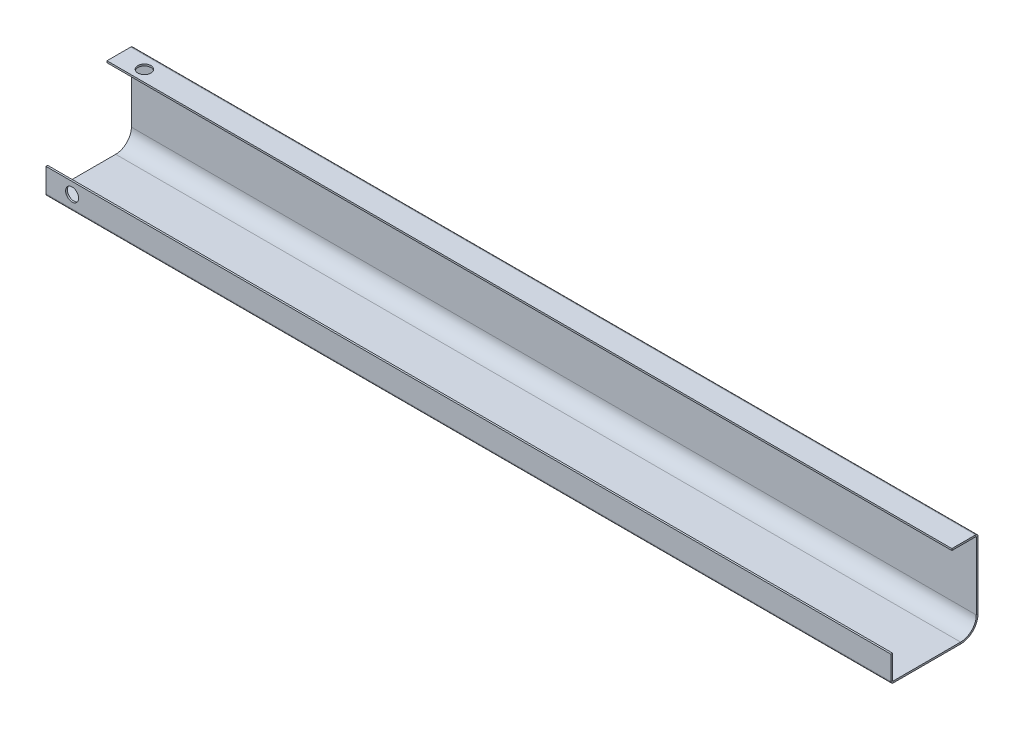
ISO-10303-21;
HEADER;
FILE_DESCRIPTION(('STEP AP214'),'2;1');
FILE_NAME('part.step','',(''),(''),'','','');
FILE_SCHEMA(('AUTOMOTIVE_DESIGN { 1 0 10303 214 1 1 1 1 }'));
ENDSEC;
DATA;
#1=APPLICATION_CONTEXT('core data for automotive mechanical design processes');
#2=APPLICATION_PROTOCOL_DEFINITION('international standard','automotive_design',2000,#1);
#3=PRODUCT_CONTEXT('',#1,'mechanical');
#4=PRODUCT('Part','Part','',(#3));
#5=PRODUCT_RELATED_PRODUCT_CATEGORY('part','',(#4));
#6=PRODUCT_DEFINITION_FORMATION('','',#4);
#7=PRODUCT_DEFINITION_CONTEXT('part definition',#1,'design');
#8=PRODUCT_DEFINITION('design','',#6,#7);
#9=PRODUCT_DEFINITION_SHAPE('','',#8);
#10=(LENGTH_UNIT() NAMED_UNIT(*) SI_UNIT(.MILLI.,.METRE.));
#11=(NAMED_UNIT(*) PLANE_ANGLE_UNIT() SI_UNIT($,.RADIAN.));
#12=(NAMED_UNIT(*) SI_UNIT($,.STERADIAN.) SOLID_ANGLE_UNIT());
#13=UNCERTAINTY_MEASURE_WITH_UNIT(LENGTH_MEASURE(1.E-05),#10,'distance_accuracy_value','');
#14=(GEOMETRIC_REPRESENTATION_CONTEXT(3) GLOBAL_UNCERTAINTY_ASSIGNED_CONTEXT((#13)) GLOBAL_UNIT_ASSIGNED_CONTEXT((#10,
#11,#12)) REPRESENTATION_CONTEXT('',''));
#15=CARTESIAN_POINT('',(0.,0.,0.));
#16=DIRECTION('',(0.,0.,1.));
#17=DIRECTION('',(1.,0.,0.));
#18=AXIS2_PLACEMENT_3D('',#15,#16,#17);
#19=CARTESIAN_POINT('',(485.,-50.,0.));
#20=DIRECTION('',(1.,0.,0.));
#21=DIRECTION('',(0.,0.,-1.));
#22=AXIS2_PLACEMENT_3D('',#19,#20,#21);
#23=PLANE('',#22);
#24=DIRECTION('',(0.,0.,1.));
#25=VECTOR('',#24,1.);
#26=CARTESIAN_POINT('',(485.,-48.,-1.73472347597681E-13));
#27=LINE('',#26,#25);
#28=CARTESIAN_POINT('',(485.,-48.0000000000003,95.2633999999996));
#29=VERTEX_POINT('',#28);
#30=CARTESIAN_POINT('',(485.,-48.0000000000001,17.9999999999999));
#31=VERTEX_POINT('',#30);
#32=EDGE_CURVE('E340',#29,#31,#27,.F.);
#33=ORIENTED_EDGE('',*,*,#32,.F.);
#34=DIRECTION('',(0.,-1.,0.));
#35=VECTOR('',#34,1.);
#36=CARTESIAN_POINT('',(485.,-48.0000000000003,95.2633999999996));
#37=LINE('',#36,#35);
#38=CARTESIAN_POINT('',(485.,-50.0000000000003,95.2633999999996));
#39=VERTEX_POINT('',#38);
#40=EDGE_CURVE('E268',#29,#39,#37,.T.);
#41=ORIENTED_EDGE('',*,*,#40,.T.);
#42=DIRECTION('',(0.,0.,-1.));
#43=VECTOR('',#42,1.);
#44=CARTESIAN_POINT('',(485.,-50.,0.));
#45=LINE('',#44,#43);
#46=CARTESIAN_POINT('',(485.,-50.0000000000001,17.9999999999999));
#47=VERTEX_POINT('',#46);
#48=EDGE_CURVE('E334',#39,#47,#45,.T.);
#49=ORIENTED_EDGE('',*,*,#48,.T.);
#50=DIRECTION('',(0.,-1.,0.));
#51=VECTOR('',#50,1.);
#52=CARTESIAN_POINT('',(485.,-48.0000000000001,17.9999999999999));
#53=LINE('',#52,#51);
#54=EDGE_CURVE('E348',#31,#47,#53,.T.);
#55=ORIENTED_EDGE('',*,*,#54,.F.);
#56=EDGE_LOOP('',(#33,#41,#49,#55));
#57=FACE_BOUND('',#56,.T.);
#58=ADVANCED_FACE('F99',(#57),#23,.T.);
#59=CARTESIAN_POINT('',(0.,-50.,-1.80455310275368E-13));
#60=DIRECTION('',(0.,-1.,0.));
#61=DIRECTION('',(0.,0.,-1.));
#62=AXIS2_PLACEMENT_3D('',#59,#60,#61);
#63=PLANE('',#62);
#64=ORIENTED_EDGE('',*,*,#48,.F.);
#65=DIRECTION('',(1.,0.,0.));
#66=VECTOR('',#65,1.);
#67=CARTESIAN_POINT('',(485.,-50.0000000000003,95.2633999999996));
#68=LINE('',#67,#66);
#69=CARTESIAN_POINT('',(-485.,-50.0000000000003,95.2633999999996));
#70=VERTEX_POINT('',#69);
#71=EDGE_CURVE('E218',#39,#70,#68,.F.);
#72=ORIENTED_EDGE('',*,*,#71,.T.);
#73=DIRECTION('',(0.,0.,1.));
#74=VECTOR('',#73,1.);
#75=CARTESIAN_POINT('',(-485.,-50.0000000000003,97.9999999999996));
#76=LINE('',#75,#74);
#77=CARTESIAN_POINT('',(-485.,-50.0000000000001,17.9999999999999));
#78=VERTEX_POINT('',#77);
#79=EDGE_CURVE('E337',#78,#70,#76,.T.);
#80=ORIENTED_EDGE('',*,*,#79,.F.);
#81=DIRECTION('',(1.,0.,0.));
#82=VECTOR('',#81,1.);
#83=CARTESIAN_POINT('',(0.,-50.0000000000001,17.9999999999999));
#84=LINE('',#83,#82);
#85=EDGE_CURVE('E345',#78,#47,#84,.T.);
#86=ORIENTED_EDGE('',*,*,#85,.T.);
#87=EDGE_LOOP('',(#64,#72,#80,#86));
#88=FACE_BOUND('',#87,.T.);
#89=ADVANCED_FACE('F425',(#88),#63,.T.);
#90=CARTESIAN_POINT('',(0.,-48.,-1.73472347597681E-13));
#91=DIRECTION('',(0.,-1.,0.));
#92=DIRECTION('',(0.,0.,-1.));
#93=AXIS2_PLACEMENT_3D('',#90,#91,#92);
#94=PLANE('',#93);
#95=DIRECTION('',(1.,0.,0.));
#96=VECTOR('',#95,1.);
#97=CARTESIAN_POINT('',(485.,-48.0000000000003,95.2633999999996));
#98=LINE('',#97,#96);
#99=CARTESIAN_POINT('',(-485.,-48.0000000000003,95.2633999999996));
#100=VERTEX_POINT('',#99);
#101=EDGE_CURVE('E272',#29,#100,#98,.F.);
#102=ORIENTED_EDGE('',*,*,#101,.F.);
#103=ORIENTED_EDGE('',*,*,#32,.T.);
#104=DIRECTION('',(-1.,0.,0.));
#105=VECTOR('',#104,1.);
#106=CARTESIAN_POINT('',(-485.,-48.0000000000001,17.9999999999999));
#107=LINE('',#106,#105);
#108=CARTESIAN_POINT('',(-485.,-48.0000000000001,17.9999999999999));
#109=VERTEX_POINT('',#108);
#110=EDGE_CURVE('E351',#109,#31,#107,.F.);
#111=ORIENTED_EDGE('',*,*,#110,.F.);
#112=DIRECTION('',(0.,0.,-1.));
#113=VECTOR('',#112,1.);
#114=CARTESIAN_POINT('',(-485.,-48.,-1.73472347597681E-13));
#115=LINE('',#114,#113);
#116=EDGE_CURVE('E342',#109,#100,#115,.F.);
#117=ORIENTED_EDGE('',*,*,#116,.T.);
#118=EDGE_LOOP('',(#102,#103,#111,#117));
#119=FACE_BOUND('',#118,.T.);
#120=ADVANCED_FACE('F411',(#119),#94,.F.);
#121=CARTESIAN_POINT('',(0.,0.,-2.));
#122=DIRECTION('',(0.,0.,1.));
#123=DIRECTION('',(1.,0.,0.));
#124=AXIS2_PLACEMENT_3D('',#121,#122,#123);
#125=PLANE('',#124);
#126=DIRECTION('',(-1.,0.,0.));
#127=VECTOR('',#126,1.);
#128=CARTESIAN_POINT('',(-485.,47.2634,-1.99999999999998));
#129=LINE('',#128,#127);
#130=CARTESIAN_POINT('',(-485.,47.2634,-1.99999999999998));
#131=VERTEX_POINT('',#130);
#132=CARTESIAN_POINT('',(485.,47.2634,-2.));
#133=VERTEX_POINT('',#132);
#134=EDGE_CURVE('E311',#131,#133,#129,.F.);
#135=ORIENTED_EDGE('',*,*,#134,.T.);
#136=DIRECTION('',(0.,1.,0.));
#137=VECTOR('',#136,1.);
#138=CARTESIAN_POINT('',(485.,50.,-2.));
#139=LINE('',#138,#137);
#140=CARTESIAN_POINT('',(485.,-30.0000000000001,-2.00000000000002));
#141=VERTEX_POINT('',#140);
#142=EDGE_CURVE('E108',#141,#133,#139,.T.);
#143=ORIENTED_EDGE('',*,*,#142,.F.);
#144=DIRECTION('',(1.,0.,0.));
#145=VECTOR('',#144,1.);
#146=CARTESIAN_POINT('',(485.,-30.0000000000001,-2.00000000000002));
#147=LINE('',#146,#145);
#148=CARTESIAN_POINT('',(-485.,-30.,-2.));
#149=VERTEX_POINT('',#148);
#150=EDGE_CURVE('E356',#141,#149,#147,.F.);
#151=ORIENTED_EDGE('',*,*,#150,.T.);
#152=DIRECTION('',(0.,-1.,0.));
#153=VECTOR('',#152,1.);
#154=CARTESIAN_POINT('',(-485.,50.,-2.));
#155=LINE('',#154,#153);
#156=EDGE_CURVE('E13',#131,#149,#155,.T.);
#157=ORIENTED_EDGE('',*,*,#156,.F.);
#158=EDGE_LOOP('',(#135,#143,#151,#157));
#159=FACE_BOUND('',#158,.T.);
#160=ADVANCED_FACE('F458',(#159),#125,.F.);
#161=CARTESIAN_POINT('',(0.,0.,0.));
#162=DIRECTION('',(0.,0.,1.));
#163=DIRECTION('',(1.,0.,0.));
#164=AXIS2_PLACEMENT_3D('',#161,#162,#163);
#165=PLANE('',#164);
#166=DIRECTION('',(0.,1.,0.));
#167=VECTOR('',#166,1.);
#168=CARTESIAN_POINT('',(485.,50.,0.));
#169=LINE('',#168,#167);
#170=CARTESIAN_POINT('',(485.,-30.0000000000001,0.));
#171=VERTEX_POINT('',#170);
#172=CARTESIAN_POINT('',(485.,47.2634,0.));
#173=VERTEX_POINT('',#172);
#174=EDGE_CURVE('E375',#171,#173,#169,.T.);
#175=ORIENTED_EDGE('',*,*,#174,.T.);
#176=DIRECTION('',(-1.,0.,0.));
#177=VECTOR('',#176,1.);
#178=CARTESIAN_POINT('',(-485.,47.2634,0.));
#179=LINE('',#178,#177);
#180=CARTESIAN_POINT('',(-485.,47.2634,0.));
#181=VERTEX_POINT('',#180);
#182=EDGE_CURVE('E323',#181,#173,#179,.F.);
#183=ORIENTED_EDGE('',*,*,#182,.F.);
#184=DIRECTION('',(0.,-1.,0.));
#185=VECTOR('',#184,1.);
#186=CARTESIAN_POINT('',(-485.,50.,0.));
#187=LINE('',#186,#185);
#188=CARTESIAN_POINT('',(-485.,-30.0000000000001,0.));
#189=VERTEX_POINT('',#188);
#190=EDGE_CURVE('E379',#181,#189,#187,.T.);
#191=ORIENTED_EDGE('',*,*,#190,.T.);
#192=DIRECTION('',(1.,0.,0.));
#193=VECTOR('',#192,1.);
#194=CARTESIAN_POINT('',(485.,-30.0000000000001,0.));
#195=LINE('',#194,#193);
#196=EDGE_CURVE('E124',#171,#189,#195,.F.);
#197=ORIENTED_EDGE('',*,*,#196,.F.);
#198=EDGE_LOOP('',(#175,#183,#191,#197));
#199=FACE_BOUND('',#198,.T.);
#200=ADVANCED_FACE('F620',(#199),#165,.T.);
#201=CARTESIAN_POINT('',(-485.,50.,-2.));
#202=DIRECTION('',(-1.,0.,0.));
#203=DIRECTION('',(0.,0.,1.));
#204=AXIS2_PLACEMENT_3D('',#201,#202,#203);
#205=PLANE('',#204);
#206=ORIENTED_EDGE('',*,*,#190,.F.);
#207=DIRECTION('',(0.,0.,-1.));
#208=VECTOR('',#207,1.);
#209=CARTESIAN_POINT('',(-485.,47.2634,0.));
#210=LINE('',#209,#208);
#211=EDGE_CURVE('E317',#181,#131,#210,.T.);
#212=ORIENTED_EDGE('',*,*,#211,.T.);
#213=ORIENTED_EDGE('',*,*,#156,.T.);
#214=DIRECTION('',(0.,0.,-1.));
#215=VECTOR('',#214,1.);
#216=CARTESIAN_POINT('',(-485.,-30.0000000000001,0.));
#217=LINE('',#216,#215);
#218=EDGE_CURVE('E372',#189,#149,#217,.T.);
#219=ORIENTED_EDGE('',*,*,#218,.F.);
#220=EDGE_LOOP('',(#206,#212,#213,#219));
#221=FACE_BOUND('',#220,.T.);
#222=ADVANCED_FACE('F609',(#221),#205,.T.);
#223=CARTESIAN_POINT('',(485.,50.,-2.));
#224=DIRECTION('',(1.,0.,0.));
#225=DIRECTION('',(0.,0.,-1.));
#226=AXIS2_PLACEMENT_3D('',#223,#224,#225);
#227=PLANE('',#226);
#228=DIRECTION('',(0.,0.,-1.));
#229=VECTOR('',#228,1.);
#230=CARTESIAN_POINT('',(485.,47.2634,0.));
#231=LINE('',#230,#229);
#232=EDGE_CURVE('E328',#173,#133,#231,.T.);
#233=ORIENTED_EDGE('',*,*,#232,.F.);
#234=ORIENTED_EDGE('',*,*,#174,.F.);
#235=DIRECTION('',(0.,0.,-1.));
#236=VECTOR('',#235,1.);
#237=CARTESIAN_POINT('',(485.,-30.0000000000001,0.));
#238=LINE('',#237,#236);
#239=EDGE_CURVE('E363',#171,#141,#238,.T.);
#240=ORIENTED_EDGE('',*,*,#239,.T.);
#241=ORIENTED_EDGE('',*,*,#142,.T.);
#242=EDGE_LOOP('',(#233,#234,#240,#241));
#243=FACE_BOUND('',#242,.T.);
#244=ADVANCED_FACE('F101',(#243),#227,.T.);
#245=CARTESIAN_POINT('',(-485.,-30.0000000000001,18.));
#246=DIRECTION('',(-1.,0.,0.));
#247=DIRECTION('',(0.,0.,1.));
#248=AXIS2_PLACEMENT_3D('',#245,#246,#247);
#249=PLANE('',#248);
#250=DIRECTION('',(0.,-1.,0.));
#251=VECTOR('',#250,1.);
#252=CARTESIAN_POINT('',(-485.,-50.0000000000001,17.9999999999999));
#253=LINE('',#252,#251);
#254=EDGE_CURVE('E331',#109,#78,#253,.T.);
#255=ORIENTED_EDGE('',*,*,#254,.F.);
#256=CARTESIAN_POINT('',(-485.,-30.0000000000001,18.));
#257=DIRECTION('',(1.,0.,0.));
#258=DIRECTION('',(0.,0.,-1.));
#259=AXIS2_PLACEMENT_3D('',#256,#257,#258);
#260=CIRCLE('',#259,18.);
#261=EDGE_CURVE('E366',#189,#109,#260,.F.);
#262=ORIENTED_EDGE('',*,*,#261,.F.);
#263=ORIENTED_EDGE('',*,*,#218,.T.);
#264=CARTESIAN_POINT('',(-485.,-30.0000000000001,18.));
#265=DIRECTION('',(1.,0.,0.));
#266=DIRECTION('',(0.,0.,-1.));
#267=AXIS2_PLACEMENT_3D('',#264,#265,#266);
#268=CIRCLE('',#267,20.);
#269=EDGE_CURVE('E359',#149,#78,#268,.F.);
#270=ORIENTED_EDGE('',*,*,#269,.T.);
#271=EDGE_LOOP('',(#255,#262,#263,#270));
#272=FACE_BOUND('',#271,.T.);
#273=ADVANCED_FACE('F431',(#272),#249,.T.);
#274=CARTESIAN_POINT('',(485.,-30.0000000000001,18.));
#275=DIRECTION('',(-1.,0.,0.));
#276=DIRECTION('',(0.,0.,1.));
#277=AXIS2_PLACEMENT_3D('',#274,#275,#276);
#278=PLANE('',#277);
#279=CARTESIAN_POINT('',(485.,-30.0000000000001,18.));
#280=DIRECTION('',(1.,0.,0.));
#281=DIRECTION('',(0.,0.,-1.));
#282=AXIS2_PLACEMENT_3D('',#279,#280,#281);
#283=CIRCLE('',#282,18.);
#284=EDGE_CURVE('E336',#31,#171,#283,.T.);
#285=ORIENTED_EDGE('',*,*,#284,.F.);
#286=ORIENTED_EDGE('',*,*,#54,.T.);
#287=CARTESIAN_POINT('',(485.,-30.0000000000001,18.));
#288=DIRECTION('',(1.,0.,0.));
#289=DIRECTION('',(0.,0.,-1.));
#290=AXIS2_PLACEMENT_3D('',#287,#288,#289);
#291=CIRCLE('',#290,20.);
#292=EDGE_CURVE('E360',#47,#141,#291,.T.);
#293=ORIENTED_EDGE('',*,*,#292,.T.);
#294=ORIENTED_EDGE('',*,*,#239,.F.);
#295=EDGE_LOOP('',(#285,#286,#293,#294));
#296=FACE_BOUND('',#295,.T.);
#297=ADVANCED_FACE('F421',(#296),#278,.F.);
#298=CARTESIAN_POINT('',(485.,-30.0000000000001,18.));
#299=DIRECTION('',(1.,0.,0.));
#300=DIRECTION('',(0.,-1.,0.));
#301=AXIS2_PLACEMENT_3D('',#298,#299,#300);
#302=CYLINDRICAL_SURFACE('',#301,20.);
#303=ORIENTED_EDGE('',*,*,#150,.F.);
#304=ORIENTED_EDGE('',*,*,#292,.F.);
#305=ORIENTED_EDGE('',*,*,#85,.F.);
#306=ORIENTED_EDGE('',*,*,#269,.F.);
#307=EDGE_LOOP('',(#303,#304,#305,#306));
#308=FACE_BOUND('',#307,.T.);
#309=ADVANCED_FACE('F429',(#308),#302,.T.);
#310=CARTESIAN_POINT('',(485.,-30.0000000000001,18.));
#311=DIRECTION('',(1.,0.,0.));
#312=DIRECTION('',(0.,-1.,0.));
#313=AXIS2_PLACEMENT_3D('',#310,#311,#312);
#314=CYLINDRICAL_SURFACE('',#313,18.);
#315=ORIENTED_EDGE('',*,*,#196,.T.);
#316=ORIENTED_EDGE('',*,*,#261,.T.);
#317=ORIENTED_EDGE('',*,*,#110,.T.);
#318=ORIENTED_EDGE('',*,*,#284,.T.);
#319=EDGE_LOOP('',(#315,#316,#317,#318));
#320=FACE_BOUND('',#319,.T.);
#321=ADVANCED_FACE('F438',(#320),#314,.F.);
#322=CARTESIAN_POINT('',(-485.,-50.0000000000003,97.9999999999996));
#323=DIRECTION('',(-1.,0.,0.));
#324=DIRECTION('',(0.,0.,1.));
#325=AXIS2_PLACEMENT_3D('',#322,#323,#324);
#326=PLANE('',#325);
#327=DIRECTION('',(0.,-1.,0.));
#328=VECTOR('',#327,1.);
#329=CARTESIAN_POINT('',(-485.,-48.0000000000003,95.2633999999996));
#330=LINE('',#329,#328);
#331=EDGE_CURVE('E275',#100,#70,#330,.T.);
#332=ORIENTED_EDGE('',*,*,#331,.F.);
#333=ORIENTED_EDGE('',*,*,#116,.F.);
#334=ORIENTED_EDGE('',*,*,#254,.T.);
#335=ORIENTED_EDGE('',*,*,#79,.T.);
#336=EDGE_LOOP('',(#332,#333,#334,#335));
#337=FACE_BOUND('',#336,.T.);
#338=ADVANCED_FACE('F435',(#337),#326,.T.);
#339=CARTESIAN_POINT('',(485.,47.2634,0.736600000000013));
#340=DIRECTION('',(1.,0.,0.));
#341=DIRECTION('',(0.,0.,-1.));
#342=AXIS2_PLACEMENT_3D('',#339,#340,#341);
#343=PLANE('',#342);
#344=DIRECTION('',(0.,1.,0.));
#345=VECTOR('',#344,1.);
#346=CARTESIAN_POINT('',(485.,50.,0.73659999999999));
#347=LINE('',#346,#345);
#348=CARTESIAN_POINT('',(485.,48.,0.736600000000011));
#349=VERTEX_POINT('',#348);
#350=CARTESIAN_POINT('',(485.,50.,0.736600000000004));
#351=VERTEX_POINT('',#350);
#352=EDGE_CURVE('E277',#349,#351,#347,.T.);
#353=ORIENTED_EDGE('',*,*,#352,.F.);
#354=CARTESIAN_POINT('',(485.,47.2634,0.736600000000013));
#355=DIRECTION('',(-1.,0.,0.));
#356=DIRECTION('',(0.,0.,1.));
#357=AXIS2_PLACEMENT_3D('',#354,#355,#356);
#358=CIRCLE('',#357,0.736599999999997);
#359=EDGE_CURVE('E320',#173,#349,#358,.F.);
#360=ORIENTED_EDGE('',*,*,#359,.F.);
#361=ORIENTED_EDGE('',*,*,#232,.T.);
#362=CARTESIAN_POINT('',(485.,47.2634,0.736600000000013));
#363=DIRECTION('',(-1.,0.,0.));
#364=DIRECTION('',(0.,0.,1.));
#365=AXIS2_PLACEMENT_3D('',#362,#363,#364);
#366=CIRCLE('',#365,2.7366);
#367=EDGE_CURVE('E313',#133,#351,#366,.F.);
#368=ORIENTED_EDGE('',*,*,#367,.T.);
#369=EDGE_LOOP('',(#353,#360,#361,#368));
#370=FACE_BOUND('',#369,.T.);
#371=ADVANCED_FACE('F437',(#370),#343,.T.);
#372=CARTESIAN_POINT('',(-485.,47.2634,0.736600000000013));
#373=DIRECTION('',(1.,0.,0.));
#374=DIRECTION('',(0.,0.,-1.));
#375=AXIS2_PLACEMENT_3D('',#372,#373,#374);
#376=PLANE('',#375);
#377=CARTESIAN_POINT('',(-485.,47.2634,0.736600000000013));
#378=DIRECTION('',(-1.,0.,0.));
#379=DIRECTION('',(0.,0.,1.));
#380=AXIS2_PLACEMENT_3D('',#377,#378,#379);
#381=CIRCLE('',#380,0.736599999999997);
#382=CARTESIAN_POINT('',(-485.,48.,0.736600000000011));
#383=VERTEX_POINT('',#382);
#384=EDGE_CURVE('E281',#383,#181,#381,.T.);
#385=ORIENTED_EDGE('',*,*,#384,.F.);
#386=DIRECTION('',(0.,1.,0.));
#387=VECTOR('',#386,1.);
#388=CARTESIAN_POINT('',(-485.,48.,0.736600000000025));
#389=LINE('',#388,#387);
#390=CARTESIAN_POINT('',(-485.,50.,0.736600000000018));
#391=VERTEX_POINT('',#390);
#392=EDGE_CURVE('E304',#383,#391,#389,.T.);
#393=ORIENTED_EDGE('',*,*,#392,.T.);
#394=CARTESIAN_POINT('',(-485.,47.2634,0.736600000000013));
#395=DIRECTION('',(-1.,0.,0.));
#396=DIRECTION('',(0.,0.,1.));
#397=AXIS2_PLACEMENT_3D('',#394,#395,#396);
#398=CIRCLE('',#397,2.7366);
#399=EDGE_CURVE('E314',#391,#131,#398,.T.);
#400=ORIENTED_EDGE('',*,*,#399,.T.);
#401=ORIENTED_EDGE('',*,*,#211,.F.);
#402=EDGE_LOOP('',(#385,#393,#400,#401));
#403=FACE_BOUND('',#402,.T.);
#404=ADVANCED_FACE('F444',(#403),#376,.F.);
#405=CARTESIAN_POINT('',(-485.,47.2634,0.736600000000013));
#406=DIRECTION('',(-1.,0.,0.));
#407=DIRECTION('',(0.,1.,0.));
#408=AXIS2_PLACEMENT_3D('',#405,#406,#407);
#409=CYLINDRICAL_SURFACE('',#408,2.7366);
#410=ORIENTED_EDGE('',*,*,#134,.F.);
#411=ORIENTED_EDGE('',*,*,#399,.F.);
#412=DIRECTION('',(-1.,0.,0.));
#413=VECTOR('',#412,1.);
#414=CARTESIAN_POINT('',(0.,50.,0.736600000000004));
#415=LINE('',#414,#413);
#416=EDGE_CURVE('E301',#351,#391,#415,.T.);
#417=ORIENTED_EDGE('',*,*,#416,.F.);
#418=ORIENTED_EDGE('',*,*,#367,.F.);
#419=EDGE_LOOP('',(#410,#411,#417,#418));
#420=FACE_BOUND('',#419,.T.);
#421=ADVANCED_FACE('F461',(#420),#409,.T.);
#422=CARTESIAN_POINT('',(-485.,47.2634,0.736600000000013));
#423=DIRECTION('',(-1.,0.,0.));
#424=DIRECTION('',(0.,1.,0.));
#425=AXIS2_PLACEMENT_3D('',#422,#423,#424);
#426=CYLINDRICAL_SURFACE('',#425,0.736599999999997);
#427=ORIENTED_EDGE('',*,*,#182,.T.);
#428=ORIENTED_EDGE('',*,*,#359,.T.);
#429=DIRECTION('',(1.,0.,0.));
#430=VECTOR('',#429,1.);
#431=CARTESIAN_POINT('',(485.,48.,0.736599999999997));
#432=LINE('',#431,#430);
#433=EDGE_CURVE('E307',#349,#383,#432,.F.);
#434=ORIENTED_EDGE('',*,*,#433,.T.);
#435=ORIENTED_EDGE('',*,*,#384,.T.);
#436=EDGE_LOOP('',(#427,#428,#434,#435));
#437=FACE_BOUND('',#436,.T.);
#438=ADVANCED_FACE('F464',(#437),#426,.F.);
#439=CARTESIAN_POINT('',(-485.,50.,0.));
#440=DIRECTION('',(-1.,0.,0.));
#441=DIRECTION('',(0.,0.,1.));
#442=AXIS2_PLACEMENT_3D('',#439,#440,#441);
#443=PLANE('',#442);
#444=DIRECTION('',(0.,0.,-1.));
#445=VECTOR('',#444,1.);
#446=CARTESIAN_POINT('',(-485.,50.,0.));
#447=LINE('',#446,#445);
#448=CARTESIAN_POINT('',(-485.,50.0000000000001,28.));
#449=VERTEX_POINT('',#448);
#450=EDGE_CURVE('E285',#449,#391,#447,.T.);
#451=ORIENTED_EDGE('',*,*,#450,.T.);
#452=ORIENTED_EDGE('',*,*,#392,.F.);
#453=DIRECTION('',(0.,0.,1.));
#454=VECTOR('',#453,1.);
#455=CARTESIAN_POINT('',(-485.,48.,-1.73472347597681E-13));
#456=LINE('',#455,#454);
#457=CARTESIAN_POINT('',(-485.,48.0000000000001,28.));
#458=VERTEX_POINT('',#457);
#459=EDGE_CURVE('E293',#458,#383,#456,.F.);
#460=ORIENTED_EDGE('',*,*,#459,.F.);
#461=DIRECTION('',(0.,-1.,0.));
#462=VECTOR('',#461,1.);
#463=CARTESIAN_POINT('',(-485.,50.0000000000001,28.));
#464=LINE('',#463,#462);
#465=EDGE_CURVE('E279',#449,#458,#464,.T.);
#466=ORIENTED_EDGE('',*,*,#465,.F.);
#467=EDGE_LOOP('',(#451,#452,#460,#466));
#468=FACE_BOUND('',#467,.T.);
#469=ADVANCED_FACE('F467',(#468),#443,.T.);
#470=CARTESIAN_POINT('',(485.,50.0000000000001,28.));
#471=DIRECTION('',(1.,0.,0.));
#472=DIRECTION('',(0.,0.,-1.));
#473=AXIS2_PLACEMENT_3D('',#470,#471,#472);
#474=PLANE('',#473);
#475=DIRECTION('',(0.,0.,-1.));
#476=VECTOR('',#475,1.);
#477=CARTESIAN_POINT('',(485.,48.,-1.73472347597681E-13));
#478=LINE('',#477,#476);
#479=CARTESIAN_POINT('',(485.,48.0000000000001,28.));
#480=VERTEX_POINT('',#479);
#481=EDGE_CURVE('E299',#349,#480,#478,.F.);
#482=ORIENTED_EDGE('',*,*,#481,.F.);
#483=ORIENTED_EDGE('',*,*,#352,.T.);
#484=DIRECTION('',(0.,0.,1.));
#485=VECTOR('',#484,1.);
#486=CARTESIAN_POINT('',(485.,50.0000000000001,28.));
#487=LINE('',#486,#485);
#488=CARTESIAN_POINT('',(485.,50.0000000000001,28.));
#489=VERTEX_POINT('',#488);
#490=EDGE_CURVE('E291',#351,#489,#487,.T.);
#491=ORIENTED_EDGE('',*,*,#490,.T.);
#492=DIRECTION('',(0.,-1.,0.));
#493=VECTOR('',#492,1.);
#494=CARTESIAN_POINT('',(485.,50.0000000000001,28.));
#495=LINE('',#494,#493);
#496=EDGE_CURVE('E282',#489,#480,#495,.T.);
#497=ORIENTED_EDGE('',*,*,#496,.T.);
#498=EDGE_LOOP('',(#482,#483,#491,#497));
#499=FACE_BOUND('',#498,.T.);
#500=ADVANCED_FACE('F472',(#499),#474,.T.);
#501=CARTESIAN_POINT('',(0.,50.,-1.80455310275367E-13));
#502=DIRECTION('',(0.,1.,0.));
#503=DIRECTION('',(0.,0.,1.));
#504=AXIS2_PLACEMENT_3D('',#501,#502,#503);
#505=PLANE('',#504);
#506=CARTESIAN_POINT('',(-455.,50.0000000000001,15.));
#507=DIRECTION('',(0.,1.,0.));
#508=DIRECTION('',(0.,0.,1.));
#509=AXIS2_PLACEMENT_3D('',#506,#507,#508);
#510=CIRCLE('',#509,7.50000000000001);
#511=CARTESIAN_POINT('',(-455.,50.0000000000001,22.5));
#512=VERTEX_POINT('',#511);
#513=EDGE_CURVE('E383',#512,#512,#510,.T.);
#514=ORIENTED_EDGE('',*,*,#513,.F.);
#515=EDGE_LOOP('',(#514));
#516=FACE_BOUND('',#515,.T.);
#517=ORIENTED_EDGE('',*,*,#490,.F.);
#518=ORIENTED_EDGE('',*,*,#416,.T.);
#519=ORIENTED_EDGE('',*,*,#450,.F.);
#520=DIRECTION('',(-1.,0.,0.));
#521=VECTOR('',#520,1.);
#522=CARTESIAN_POINT('',(-485.,50.0000000000001,28.));
#523=LINE('',#522,#521);
#524=EDGE_CURVE('E288',#489,#449,#523,.T.);
#525=ORIENTED_EDGE('',*,*,#524,.F.);
#526=EDGE_LOOP('',(#517,#518,#519,#525));
#527=FACE_BOUND('',#526,.T.);
#528=ADVANCED_FACE('F475',(#516,#527),#505,.T.);
#529=CARTESIAN_POINT('',(0.,48.,-1.73472347597681E-13));
#530=DIRECTION('',(0.,1.,0.));
#531=DIRECTION('',(0.,0.,1.));
#532=AXIS2_PLACEMENT_3D('',#529,#530,#531);
#533=PLANE('',#532);
#534=CARTESIAN_POINT('',(-455.,48.0000000000001,15.));
#535=DIRECTION('',(0.,1.,0.));
#536=DIRECTION('',(0.,0.,1.));
#537=AXIS2_PLACEMENT_3D('',#534,#535,#536);
#538=CIRCLE('',#537,7.50000000000001);
#539=CARTESIAN_POINT('',(-455.,48.0000000000001,22.5));
#540=VERTEX_POINT('',#539);
#541=EDGE_CURVE('E266',#540,#540,#538,.T.);
#542=ORIENTED_EDGE('',*,*,#541,.T.);
#543=EDGE_LOOP('',(#542));
#544=FACE_BOUND('',#543,.T.);
#545=ORIENTED_EDGE('',*,*,#433,.F.);
#546=ORIENTED_EDGE('',*,*,#481,.T.);
#547=DIRECTION('',(1.,0.,0.));
#548=VECTOR('',#547,1.);
#549=CARTESIAN_POINT('',(0.,48.0000000000001,28.));
#550=LINE('',#549,#548);
#551=EDGE_CURVE('E296',#480,#458,#550,.F.);
#552=ORIENTED_EDGE('',*,*,#551,.T.);
#553=ORIENTED_EDGE('',*,*,#459,.T.);
#554=EDGE_LOOP('',(#545,#546,#552,#553));
#555=FACE_BOUND('',#554,.T.);
#556=ADVANCED_FACE('F480',(#544,#555),#533,.F.);
#557=CARTESIAN_POINT('',(-485.,50.0000000000001,28.));
#558=DIRECTION('',(0.,0.,1.));
#559=DIRECTION('',(0.,-1.,0.));
#560=AXIS2_PLACEMENT_3D('',#557,#558,#559);
#561=PLANE('',#560);
#562=ORIENTED_EDGE('',*,*,#551,.F.);
#563=ORIENTED_EDGE('',*,*,#496,.F.);
#564=ORIENTED_EDGE('',*,*,#524,.T.);
#565=ORIENTED_EDGE('',*,*,#465,.T.);
#566=EDGE_LOOP('',(#562,#563,#564,#565));
#567=FACE_BOUND('',#566,.T.);
#568=ADVANCED_FACE('F477',(#567),#561,.T.);
#569=CARTESIAN_POINT('',(-485.,-47.2634000000003,95.2633999999996));
#570=DIRECTION('',(-1.,0.,0.));
#571=DIRECTION('',(0.,0.,1.));
#572=AXIS2_PLACEMENT_3D('',#569,#570,#571);
#573=PLANE('',#572);
#574=DIRECTION('',(0.,0.,1.));
#575=VECTOR('',#574,1.);
#576=CARTESIAN_POINT('',(-485.,-47.2634000000003,97.9999999999999));
#577=LINE('',#576,#575);
#578=CARTESIAN_POINT('',(-485.,-47.2634000000003,95.9999999999997));
#579=VERTEX_POINT('',#578);
#580=CARTESIAN_POINT('',(-485.,-47.2634000000004,97.9999999999997));
#581=VERTEX_POINT('',#580);
#582=EDGE_CURVE('E263',#579,#581,#577,.T.);
#583=ORIENTED_EDGE('',*,*,#582,.F.);
#584=CARTESIAN_POINT('',(-485.,-47.2634000000003,95.2633999999996));
#585=DIRECTION('',(1.,0.,0.));
#586=DIRECTION('',(0.,0.,-1.));
#587=AXIS2_PLACEMENT_3D('',#584,#585,#586);
#588=CIRCLE('',#587,0.736600000000004);
#589=EDGE_CURVE('E221',#100,#579,#588,.F.);
#590=ORIENTED_EDGE('',*,*,#589,.F.);
#591=ORIENTED_EDGE('',*,*,#331,.T.);
#592=CARTESIAN_POINT('',(-485.,-47.2634000000003,95.2633999999996));
#593=DIRECTION('',(1.,0.,0.));
#594=DIRECTION('',(0.,0.,-1.));
#595=AXIS2_PLACEMENT_3D('',#592,#593,#594);
#596=CIRCLE('',#595,2.7366);
#597=EDGE_CURVE('E116',#70,#581,#596,.F.);
#598=ORIENTED_EDGE('',*,*,#597,.T.);
#599=EDGE_LOOP('',(#583,#590,#591,#598));
#600=FACE_BOUND('',#599,.T.);
#601=ADVANCED_FACE('F405',(#600),#573,.T.);
#602=CARTESIAN_POINT('',(485.,-47.2634000000003,95.2633999999996));
#603=DIRECTION('',(-1.,0.,0.));
#604=DIRECTION('',(0.,0.,1.));
#605=AXIS2_PLACEMENT_3D('',#602,#603,#604);
#606=PLANE('',#605);
#607=CARTESIAN_POINT('',(485.,-47.2634000000003,95.2633999999996));
#608=DIRECTION('',(1.,0.,0.));
#609=DIRECTION('',(0.,0.,-1.));
#610=AXIS2_PLACEMENT_3D('',#607,#608,#609);
#611=CIRCLE('',#610,0.736600000000004);
#612=CARTESIAN_POINT('',(485.,-47.2634000000003,95.9999999999997));
#613=VERTEX_POINT('',#612);
#614=EDGE_CURVE('E228',#613,#29,#611,.T.);
#615=ORIENTED_EDGE('',*,*,#614,.F.);
#616=DIRECTION('',(0.,0.,1.));
#617=VECTOR('',#616,1.);
#618=CARTESIAN_POINT('',(485.,-47.2634000000003,95.9999999999997));
#619=LINE('',#618,#617);
#620=CARTESIAN_POINT('',(485.,-47.2634000000003,97.9999999999997));
#621=VERTEX_POINT('',#620);
#622=EDGE_CURVE('E225',#613,#621,#619,.T.);
#623=ORIENTED_EDGE('',*,*,#622,.T.);
#624=CARTESIAN_POINT('',(485.,-47.2634000000003,95.2633999999996));
#625=DIRECTION('',(1.,0.,0.));
#626=DIRECTION('',(0.,0.,-1.));
#627=AXIS2_PLACEMENT_3D('',#624,#625,#626);
#628=CIRCLE('',#627,2.7366);
#629=EDGE_CURVE('E212',#621,#39,#628,.T.);
#630=ORIENTED_EDGE('',*,*,#629,.T.);
#631=ORIENTED_EDGE('',*,*,#40,.F.);
#632=EDGE_LOOP('',(#615,#623,#630,#631));
#633=FACE_BOUND('',#632,.T.);
#634=ADVANCED_FACE('F226',(#633),#606,.F.);
#635=CARTESIAN_POINT('',(485.,-47.2634000000003,95.2633999999996));
#636=DIRECTION('',(1.,0.,0.));
#637=DIRECTION('',(0.,0.,1.));
#638=AXIS2_PLACEMENT_3D('',#635,#636,#637);
#639=CYLINDRICAL_SURFACE('',#638,2.7366);
#640=ORIENTED_EDGE('',*,*,#71,.F.);
#641=ORIENTED_EDGE('',*,*,#629,.F.);
#642=DIRECTION('',(1.,0.,0.));
#643=VECTOR('',#642,1.);
#644=CARTESIAN_POINT('',(0.,-47.2634000000003,97.9999999999997));
#645=LINE('',#644,#643);
#646=EDGE_CURVE('E216',#581,#621,#645,.T.);
#647=ORIENTED_EDGE('',*,*,#646,.F.);
#648=ORIENTED_EDGE('',*,*,#597,.F.);
#649=EDGE_LOOP('',(#640,#641,#647,#648));
#650=FACE_BOUND('',#649,.T.);
#651=ADVANCED_FACE('F214',(#650),#639,.T.);
#652=CARTESIAN_POINT('',(485.,-47.2634000000003,95.2633999999996));
#653=DIRECTION('',(1.,0.,0.));
#654=DIRECTION('',(0.,0.,1.));
#655=AXIS2_PLACEMENT_3D('',#652,#653,#654);
#656=CYLINDRICAL_SURFACE('',#655,0.736600000000004);
#657=ORIENTED_EDGE('',*,*,#101,.T.);
#658=ORIENTED_EDGE('',*,*,#589,.T.);
#659=DIRECTION('',(-1.,0.,0.));
#660=VECTOR('',#659,1.);
#661=CARTESIAN_POINT('',(-485.,-47.2634000000003,95.9999999999997));
#662=LINE('',#661,#660);
#663=EDGE_CURVE('E233',#579,#613,#662,.F.);
#664=ORIENTED_EDGE('',*,*,#663,.T.);
#665=ORIENTED_EDGE('',*,*,#614,.T.);
#666=EDGE_LOOP('',(#657,#658,#664,#665));
#667=FACE_BOUND('',#666,.T.);
#668=ADVANCED_FACE('F407',(#667),#656,.F.);
#669=CARTESIAN_POINT('',(485.,-48.0000000000003,97.9999999999997));
#670=DIRECTION('',(1.,0.,0.));
#671=DIRECTION('',(0.,0.,-1.));
#672=AXIS2_PLACEMENT_3D('',#669,#670,#671);
#673=PLANE('',#672);
#674=DIRECTION('',(0.,-1.,0.));
#675=VECTOR('',#674,1.);
#676=CARTESIAN_POINT('',(485.,-48.0000000000003,97.9999999999997));
#677=LINE('',#676,#675);
#678=CARTESIAN_POINT('',(485.,-20.0000000000003,97.9999999999999));
#679=VERTEX_POINT('',#678);
#680=EDGE_CURVE('E240',#679,#621,#677,.T.);
#681=ORIENTED_EDGE('',*,*,#680,.T.);
#682=ORIENTED_EDGE('',*,*,#622,.F.);
#683=DIRECTION('',(0.,1.,0.));
#684=VECTOR('',#683,1.);
#685=CARTESIAN_POINT('',(485.,-6.73072708679001E-13,96.));
#686=LINE('',#685,#684);
#687=CARTESIAN_POINT('',(485.,-20.0000000000003,95.9999999999998));
#688=VERTEX_POINT('',#687);
#689=EDGE_CURVE('E256',#688,#613,#686,.F.);
#690=ORIENTED_EDGE('',*,*,#689,.F.);
#691=DIRECTION('',(0.,0.,-1.));
#692=VECTOR('',#691,1.);
#693=CARTESIAN_POINT('',(485.,-20.0000000000003,97.9999999999999));
#694=LINE('',#693,#692);
#695=EDGE_CURVE('E245',#679,#688,#694,.T.);
#696=ORIENTED_EDGE('',*,*,#695,.F.);
#697=EDGE_LOOP('',(#681,#682,#690,#696));
#698=FACE_BOUND('',#697,.T.);
#699=ADVANCED_FACE('F244',(#698),#673,.T.);
#700=CARTESIAN_POINT('',(-485.,-20.0000000000003,97.9999999999999));
#701=DIRECTION('',(-1.,0.,0.));
#702=DIRECTION('',(0.,0.,1.));
#703=AXIS2_PLACEMENT_3D('',#700,#701,#702);
#704=PLANE('',#703);
#705=DIRECTION('',(0.,-1.,0.));
#706=VECTOR('',#705,1.);
#707=CARTESIAN_POINT('',(-485.,-6.73072708679001E-13,96.));
#708=LINE('',#707,#706);
#709=CARTESIAN_POINT('',(-485.,-20.0000000000003,95.9999999999998));
#710=VERTEX_POINT('',#709);
#711=EDGE_CURVE('E242',#579,#710,#708,.F.);
#712=ORIENTED_EDGE('',*,*,#711,.F.);
#713=ORIENTED_EDGE('',*,*,#582,.T.);
#714=DIRECTION('',(0.,1.,0.));
#715=VECTOR('',#714,1.);
#716=CARTESIAN_POINT('',(-485.,-20.0000000000003,97.9999999999999));
#717=LINE('',#716,#715);
#718=CARTESIAN_POINT('',(-485.,-20.0000000000003,97.9999999999999));
#719=VERTEX_POINT('',#718);
#720=EDGE_CURVE('E241',#581,#719,#717,.T.);
#721=ORIENTED_EDGE('',*,*,#720,.T.);
#722=DIRECTION('',(0.,0.,-1.));
#723=VECTOR('',#722,1.);
#724=CARTESIAN_POINT('',(-485.,-20.0000000000003,97.9999999999999));
#725=LINE('',#724,#723);
#726=EDGE_CURVE('E247',#719,#710,#725,.T.);
#727=ORIENTED_EDGE('',*,*,#726,.T.);
#728=EDGE_LOOP('',(#712,#713,#721,#727));
#729=FACE_BOUND('',#728,.T.);
#730=ADVANCED_FACE('F402',(#729),#704,.T.);
#731=CARTESIAN_POINT('',(0.,-6.86994565260595E-13,98.));
#732=DIRECTION('',(0.,0.,1.));
#733=DIRECTION('',(0.,-1.,0.));
#734=AXIS2_PLACEMENT_3D('',#731,#732,#733);
#735=PLANE('',#734);
#736=CARTESIAN_POINT('',(-455.,-33.0000000000003,98.));
#737=DIRECTION('',(0.,0.,1.));
#738=DIRECTION('',(1.,0.,0.));
#739=AXIS2_PLACEMENT_3D('',#736,#737,#738);
#740=CIRCLE('',#739,7.50000000000001);
#741=CARTESIAN_POINT('',(-447.5,-33.0000000000003,98.));
#742=VERTEX_POINT('',#741);
#743=EDGE_CURVE('E391',#742,#742,#740,.T.);
#744=ORIENTED_EDGE('',*,*,#743,.F.);
#745=EDGE_LOOP('',(#744));
#746=FACE_BOUND('',#745,.T.);
#747=ORIENTED_EDGE('',*,*,#720,.F.);
#748=ORIENTED_EDGE('',*,*,#646,.T.);
#749=ORIENTED_EDGE('',*,*,#680,.F.);
#750=DIRECTION('',(1.,0.,0.));
#751=VECTOR('',#750,1.);
#752=CARTESIAN_POINT('',(485.,-20.0000000000003,97.9999999999999));
#753=LINE('',#752,#751);
#754=EDGE_CURVE('E248',#719,#679,#753,.T.);
#755=ORIENTED_EDGE('',*,*,#754,.F.);
#756=EDGE_LOOP('',(#747,#748,#749,#755));
#757=FACE_BOUND('',#756,.T.);
#758=ADVANCED_FACE('F238',(#746,#757),#735,.T.);
#759=CARTESIAN_POINT('',(0.,-6.73072708679001E-13,96.));
#760=DIRECTION('',(0.,0.,1.));
#761=DIRECTION('',(0.,-1.,0.));
#762=AXIS2_PLACEMENT_3D('',#759,#760,#761);
#763=PLANE('',#762);
#764=CARTESIAN_POINT('',(-455.,-33.0000000000003,95.9999999999998));
#765=DIRECTION('',(0.,0.,1.));
#766=DIRECTION('',(0.,-1.,0.));
#767=AXIS2_PLACEMENT_3D('',#764,#765,#766);
#768=CIRCLE('',#767,7.50000000000001);
#769=CARTESIAN_POINT('',(-455.,-40.5000000000004,95.9999999999997));
#770=VERTEX_POINT('',#769);
#771=EDGE_CURVE('E103',#770,#770,#768,.T.);
#772=ORIENTED_EDGE('',*,*,#771,.T.);
#773=EDGE_LOOP('',(#772));
#774=FACE_BOUND('',#773,.T.);
#775=ORIENTED_EDGE('',*,*,#663,.F.);
#776=ORIENTED_EDGE('',*,*,#711,.T.);
#777=DIRECTION('',(-1.,0.,0.));
#778=VECTOR('',#777,1.);
#779=CARTESIAN_POINT('',(0.,-20.0000000000003,95.9999999999998));
#780=LINE('',#779,#778);
#781=EDGE_CURVE('E258',#710,#688,#780,.F.);
#782=ORIENTED_EDGE('',*,*,#781,.T.);
#783=ORIENTED_EDGE('',*,*,#689,.T.);
#784=EDGE_LOOP('',(#775,#776,#782,#783));
#785=FACE_BOUND('',#784,.T.);
#786=ADVANCED_FACE('F399',(#774,#785),#763,.F.);
#787=CARTESIAN_POINT('',(485.,-20.0000000000003,97.9999999999999));
#788=DIRECTION('',(0.,1.,0.));
#789=DIRECTION('',(0.,0.,1.));
#790=AXIS2_PLACEMENT_3D('',#787,#788,#789);
#791=PLANE('',#790);
#792=ORIENTED_EDGE('',*,*,#781,.F.);
#793=ORIENTED_EDGE('',*,*,#726,.F.);
#794=ORIENTED_EDGE('',*,*,#754,.T.);
#795=ORIENTED_EDGE('',*,*,#695,.T.);
#796=EDGE_LOOP('',(#792,#793,#794,#795));
#797=FACE_BOUND('',#796,.T.);
#798=ADVANCED_FACE('F395',(#797),#791,.T.);
#799=CARTESIAN_POINT('',(-455.,40.0000000000001,15.));
#800=DIRECTION('',(0.,1.,0.));
#801=DIRECTION('',(0.,0.,1.));
#802=AXIS2_PLACEMENT_3D('',#799,#800,#801);
#803=CYLINDRICAL_SURFACE('',#802,7.50000000000001);
#804=ORIENTED_EDGE('',*,*,#513,.T.);
#805=EDGE_LOOP('',(#804));
#806=FACE_BOUND('',#805,.T.);
#807=ORIENTED_EDGE('',*,*,#541,.F.);
#808=EDGE_LOOP('',(#807));
#809=FACE_BOUND('',#808,.T.);
#810=ADVANCED_FACE('F502',(#806,#809),#803,.F.);
#811=CARTESIAN_POINT('',(-455.,-33.0000000000003,88.));
#812=DIRECTION('',(0.,0.,1.));
#813=DIRECTION('',(1.,0.,0.));
#814=AXIS2_PLACEMENT_3D('',#811,#812,#813);
#815=CYLINDRICAL_SURFACE('',#814,7.50000000000001);
#816=ORIENTED_EDGE('',*,*,#743,.T.);
#817=EDGE_LOOP('',(#816));
#818=FACE_BOUND('',#817,.T.);
#819=ORIENTED_EDGE('',*,*,#771,.F.);
#820=EDGE_LOOP('',(#819));
#821=FACE_BOUND('',#820,.T.);
#822=ADVANCED_FACE('F513',(#818,#821),#815,.F.);
#823=CLOSED_SHELL('',(#58,#89,#120,#160,#200,#222,#244,#273,#297,#309,#321,#338,#371,#404,#421,
#438,#469,#500,#528,#556,#568,#601,#634,#651,#668,#699,#730,#758,#786,#798,#810,#822));
#824=MANIFOLD_SOLID_BREP('B2',#823);
#825=ADVANCED_BREP_SHAPE_REPRESENTATION('',(#18,#824),#14);
#826=SHAPE_DEFINITION_REPRESENTATION(#9,#825);
ENDSEC;
END-ISO-10303-21;
